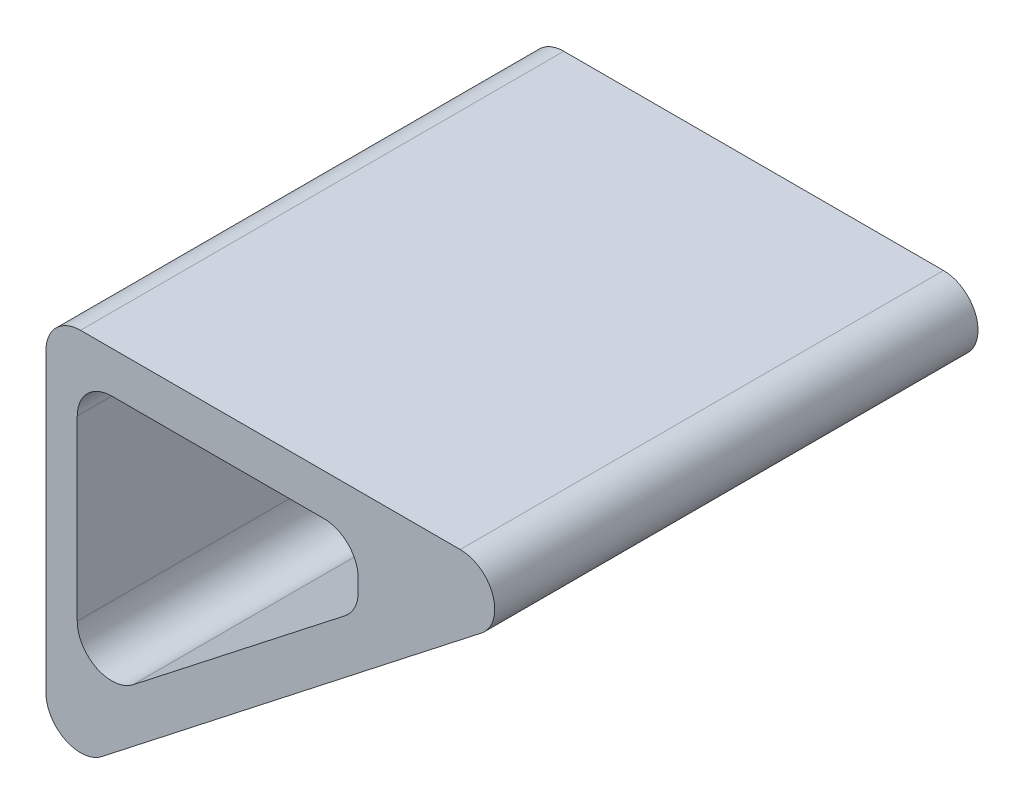
ISO-10303-21;
HEADER;
FILE_DESCRIPTION(('STEP AP214'),'2;1');
FILE_NAME('part.step','',(''),(''),'','','');
FILE_SCHEMA(('AUTOMOTIVE_DESIGN { 1 0 10303 214 1 1 1 1 }'));
ENDSEC;
DATA;
#1=APPLICATION_CONTEXT('core data for automotive mechanical design processes');
#2=APPLICATION_PROTOCOL_DEFINITION('international standard','automotive_design',2000,#1);
#3=PRODUCT_CONTEXT('',#1,'mechanical');
#4=PRODUCT('Part','Part','',(#3));
#5=PRODUCT_RELATED_PRODUCT_CATEGORY('part','',(#4));
#6=PRODUCT_DEFINITION_FORMATION('','',#4);
#7=PRODUCT_DEFINITION_CONTEXT('part definition',#1,'design');
#8=PRODUCT_DEFINITION('design','',#6,#7);
#9=PRODUCT_DEFINITION_SHAPE('','',#8);
#10=(LENGTH_UNIT() NAMED_UNIT(*) SI_UNIT(.MILLI.,.METRE.));
#11=(NAMED_UNIT(*) PLANE_ANGLE_UNIT() SI_UNIT($,.RADIAN.));
#12=(NAMED_UNIT(*) SI_UNIT($,.STERADIAN.) SOLID_ANGLE_UNIT());
#13=UNCERTAINTY_MEASURE_WITH_UNIT(LENGTH_MEASURE(1.E-05),#10,'distance_accuracy_value','');
#14=(GEOMETRIC_REPRESENTATION_CONTEXT(3) GLOBAL_UNCERTAINTY_ASSIGNED_CONTEXT((#13)) GLOBAL_UNIT_ASSIGNED_CONTEXT((#10,
#11,#12)) REPRESENTATION_CONTEXT('',''));
#15=CARTESIAN_POINT('',(0.,0.,0.));
#16=DIRECTION('',(0.,0.,1.));
#17=DIRECTION('',(1.,0.,0.));
#18=AXIS2_PLACEMENT_3D('',#15,#16,#17);
#19=CARTESIAN_POINT('',(21.0206811035827,17.98508750142,70.));
#20=DIRECTION('',(0.,0.,-1.));
#21=DIRECTION('',(-1.,0.,0.));
#22=AXIS2_PLACEMENT_3D('',#19,#20,#21);
#23=CYLINDRICAL_SURFACE('',#22,5.);
#24=CARTESIAN_POINT('',(21.0206811035827,17.98508750142,0.));
#25=DIRECTION('',(0.,0.,1.));
#26=DIRECTION('',(1.,0.,0.));
#27=AXIS2_PLACEMENT_3D('',#24,#25,#26);
#28=CIRCLE('',#27,5.);
#29=CARTESIAN_POINT('',(21.0206811035827,22.98508750142,0.));
#30=VERTEX_POINT('',#29);
#31=CARTESIAN_POINT('',(24.1002909355704,14.0460516698078,0.));
#32=VERTEX_POINT('',#31);
#33=EDGE_CURVE('E236',#30,#32,#28,.F.);
#34=ORIENTED_EDGE('',*,*,#33,.F.);
#35=DIRECTION('',(0.,0.,-1.));
#36=VECTOR('',#35,1.);
#37=CARTESIAN_POINT('',(21.0206811035827,22.98508750142,70.));
#38=LINE('',#37,#36);
#39=CARTESIAN_POINT('',(21.0206811035827,22.98508750142,70.));
#40=VERTEX_POINT('',#39);
#41=EDGE_CURVE('E11',#40,#30,#38,.T.);
#42=ORIENTED_EDGE('',*,*,#41,.F.);
#43=CARTESIAN_POINT('',(21.0206811035827,17.98508750142,70.));
#44=DIRECTION('',(0.,0.,1.));
#45=DIRECTION('',(1.,0.,0.));
#46=AXIS2_PLACEMENT_3D('',#43,#44,#45);
#47=CIRCLE('',#46,5.);
#48=CARTESIAN_POINT('',(24.1002909355704,14.0460516698078,70.));
#49=VERTEX_POINT('',#48);
#50=EDGE_CURVE('E278',#40,#49,#47,.F.);
#51=ORIENTED_EDGE('',*,*,#50,.T.);
#52=DIRECTION('',(0.,0.,-1.));
#53=VECTOR('',#52,1.);
#54=CARTESIAN_POINT('',(24.1002909355704,14.0460516698078,70.));
#55=LINE('',#54,#53);
#56=EDGE_CURVE('E118',#49,#32,#55,.T.);
#57=ORIENTED_EDGE('',*,*,#56,.T.);
#58=EDGE_LOOP('',(#34,#42,#51,#57));
#59=FACE_BOUND('',#58,.T.);
#60=ADVANCED_FACE('F50',(#59),#23,.T.);
#61=CARTESIAN_POINT('',(0.,22.98508750142,70.));
#62=DIRECTION('',(0.,-1.,0.));
#63=DIRECTION('',(0.,0.,-1.));
#64=AXIS2_PLACEMENT_3D('',#61,#62,#63);
#65=PLANE('',#64);
#66=DIRECTION('',(-1.,0.,0.));
#67=VECTOR('',#66,1.);
#68=CARTESIAN_POINT('',(0.,22.98508750142,0.));
#69=LINE('',#68,#67);
#70=CARTESIAN_POINT('',(-33.9793188964173,22.98508750142,0.));
#71=VERTEX_POINT('',#70);
#72=EDGE_CURVE('E232',#30,#71,#69,.T.);
#73=ORIENTED_EDGE('',*,*,#72,.T.);
#74=DIRECTION('',(0.,0.,-1.));
#75=VECTOR('',#74,1.);
#76=CARTESIAN_POINT('',(-33.9793188964173,22.98508750142,70.));
#77=LINE('',#76,#75);
#78=CARTESIAN_POINT('',(-33.9793188964173,22.98508750142,70.));
#79=VERTEX_POINT('',#78);
#80=EDGE_CURVE('E59',#79,#71,#77,.T.);
#81=ORIENTED_EDGE('',*,*,#80,.F.);
#82=DIRECTION('',(-1.,0.,0.));
#83=VECTOR('',#82,1.);
#84=CARTESIAN_POINT('',(0.,22.98508750142,70.));
#85=LINE('',#84,#83);
#86=EDGE_CURVE('E280',#40,#79,#85,.T.);
#87=ORIENTED_EDGE('',*,*,#86,.F.);
#88=ORIENTED_EDGE('',*,*,#41,.T.);
#89=EDGE_LOOP('',(#73,#81,#87,#88));
#90=FACE_BOUND('',#89,.T.);
#91=ADVANCED_FACE('F350',(#90),#65,.F.);
#92=CARTESIAN_POINT('',(-33.9793188964173,17.98508750142,70.));
#93=DIRECTION('',(0.,0.,-1.));
#94=DIRECTION('',(-1.,0.,0.));
#95=AXIS2_PLACEMENT_3D('',#92,#93,#94);
#96=CYLINDRICAL_SURFACE('',#95,5.);
#97=CARTESIAN_POINT('',(-33.9793188964173,17.98508750142,0.));
#98=DIRECTION('',(0.,0.,1.));
#99=DIRECTION('',(1.,0.,0.));
#100=AXIS2_PLACEMENT_3D('',#97,#98,#99);
#101=CIRCLE('',#100,5.);
#102=CARTESIAN_POINT('',(-38.9793188964173,17.98508750142,0.));
#103=VERTEX_POINT('',#102);
#104=EDGE_CURVE('E230',#71,#103,#101,.T.);
#105=ORIENTED_EDGE('',*,*,#104,.T.);
#106=DIRECTION('',(0.,0.,-1.));
#107=VECTOR('',#106,1.);
#108=CARTESIAN_POINT('',(-38.9793188964173,17.98508750142,70.));
#109=LINE('',#108,#107);
#110=CARTESIAN_POINT('',(-38.9793188964173,17.98508750142,70.));
#111=VERTEX_POINT('',#110);
#112=EDGE_CURVE('E181',#111,#103,#109,.T.);
#113=ORIENTED_EDGE('',*,*,#112,.F.);
#114=CARTESIAN_POINT('',(-33.9793188964173,17.98508750142,70.));
#115=DIRECTION('',(0.,0.,1.));
#116=DIRECTION('',(1.,0.,0.));
#117=AXIS2_PLACEMENT_3D('',#114,#115,#116);
#118=CIRCLE('',#117,5.);
#119=EDGE_CURVE('E173',#79,#111,#118,.T.);
#120=ORIENTED_EDGE('',*,*,#119,.F.);
#121=ORIENTED_EDGE('',*,*,#80,.T.);
#122=EDGE_LOOP('',(#105,#113,#120,#121));
#123=FACE_BOUND('',#122,.T.);
#124=ADVANCED_FACE('F352',(#123),#96,.T.);
#125=CARTESIAN_POINT('',(-38.9793188964173,0.,70.));
#126=DIRECTION('',(1.,0.,0.));
#127=DIRECTION('',(0.,1.,0.));
#128=AXIS2_PLACEMENT_3D('',#125,#126,#127);
#129=PLANE('',#128);
#130=DIRECTION('',(0.,-1.,0.));
#131=VECTOR('',#130,1.);
#132=CARTESIAN_POINT('',(-38.9793188964173,0.,0.));
#133=LINE('',#132,#131);
#134=CARTESIAN_POINT('',(-38.9793188964173,-25.01491249858,0.));
#135=VERTEX_POINT('',#134);
#136=EDGE_CURVE('E182',#103,#135,#133,.T.);
#137=ORIENTED_EDGE('',*,*,#136,.T.);
#138=DIRECTION('',(0.,0.,-1.));
#139=VECTOR('',#138,1.);
#140=CARTESIAN_POINT('',(-38.9793188964173,-25.01491249858,70.));
#141=LINE('',#140,#139);
#142=CARTESIAN_POINT('',(-38.9793188964173,-25.01491249858,70.));
#143=VERTEX_POINT('',#142);
#144=EDGE_CURVE('E164',#143,#135,#141,.T.);
#145=ORIENTED_EDGE('',*,*,#144,.F.);
#146=DIRECTION('',(0.,-1.,0.));
#147=VECTOR('',#146,1.);
#148=CARTESIAN_POINT('',(-38.9793188964173,0.,70.));
#149=LINE('',#148,#147);
#150=EDGE_CURVE('E166',#111,#143,#149,.T.);
#151=ORIENTED_EDGE('',*,*,#150,.F.);
#152=ORIENTED_EDGE('',*,*,#112,.T.);
#153=EDGE_LOOP('',(#137,#145,#151,#152));
#154=FACE_BOUND('',#153,.T.);
#155=ADVANCED_FACE('F179',(#154),#129,.F.);
#156=CARTESIAN_POINT('',(-33.9793188964173,-25.01491249858,70.));
#157=DIRECTION('',(0.,0.,-1.));
#158=DIRECTION('',(-1.,0.,0.));
#159=AXIS2_PLACEMENT_3D('',#156,#157,#158);
#160=CYLINDRICAL_SURFACE('',#159,5.);
#161=CARTESIAN_POINT('',(-33.9793188964173,-25.01491249858,0.));
#162=DIRECTION('',(0.,0.,1.));
#163=DIRECTION('',(1.,0.,0.));
#164=AXIS2_PLACEMENT_3D('',#161,#162,#163);
#165=CIRCLE('',#164,5.);
#166=CARTESIAN_POINT('',(-30.8997090644296,-28.9539483301922,0.));
#167=VERTEX_POINT('',#166);
#168=EDGE_CURVE('E223',#135,#167,#165,.T.);
#169=ORIENTED_EDGE('',*,*,#168,.T.);
#170=DIRECTION('',(0.,0.,-1.));
#171=VECTOR('',#170,1.);
#172=CARTESIAN_POINT('',(-30.8997090644296,-28.9539483301922,70.));
#173=LINE('',#172,#171);
#174=CARTESIAN_POINT('',(-30.8997090644296,-28.9539483301922,70.));
#175=VERTEX_POINT('',#174);
#176=EDGE_CURVE('E170',#175,#167,#173,.T.);
#177=ORIENTED_EDGE('',*,*,#176,.F.);
#178=CARTESIAN_POINT('',(-33.9793188964173,-25.01491249858,70.));
#179=DIRECTION('',(0.,0.,1.));
#180=DIRECTION('',(1.,0.,0.));
#181=AXIS2_PLACEMENT_3D('',#178,#179,#180);
#182=CIRCLE('',#181,5.);
#183=EDGE_CURVE('E159',#143,#175,#182,.T.);
#184=ORIENTED_EDGE('',*,*,#183,.F.);
#185=ORIENTED_EDGE('',*,*,#144,.T.);
#186=EDGE_LOOP('',(#169,#177,#184,#185));
#187=FACE_BOUND('',#186,.T.);
#188=ADVANCED_FACE('F162',(#187),#160,.T.);
#189=CARTESIAN_POINT('',(1.24586127284532,11.9981078974386,70.));
#190=DIRECTION('',(0.,0.,-1.));
#191=DIRECTION('',(-1.,0.,0.));
#192=AXIS2_PLACEMENT_3D('',#189,#190,#191);
#193=CYLINDRICAL_SURFACE('',#192,5.);
#194=CARTESIAN_POINT('',(1.24586127284532,11.9981078974386,0.));
#195=DIRECTION('',(0.,0.,1.));
#196=DIRECTION('',(1.,0.,0.));
#197=AXIS2_PLACEMENT_3D('',#194,#195,#196);
#198=CIRCLE('',#197,5.);
#199=CARTESIAN_POINT('',(6.24586127284532,11.9981078974386,0.));
#200=VERTEX_POINT('',#199);
#201=CARTESIAN_POINT('',(1.24586127284532,16.9981078974386,0.));
#202=VERTEX_POINT('',#201);
#203=EDGE_CURVE('E267',#200,#202,#198,.T.);
#204=ORIENTED_EDGE('',*,*,#203,.F.);
#205=DIRECTION('',(0.,0.,-1.));
#206=VECTOR('',#205,1.);
#207=CARTESIAN_POINT('',(6.24586127284532,11.9981078974386,70.));
#208=LINE('',#207,#206);
#209=CARTESIAN_POINT('',(6.24586127284532,11.9981078974386,70.));
#210=VERTEX_POINT('',#209);
#211=EDGE_CURVE('E51',#210,#200,#208,.T.);
#212=ORIENTED_EDGE('',*,*,#211,.F.);
#213=CARTESIAN_POINT('',(1.24586127284532,11.9981078974386,70.));
#214=DIRECTION('',(0.,0.,1.));
#215=DIRECTION('',(1.,0.,0.));
#216=AXIS2_PLACEMENT_3D('',#213,#214,#215);
#217=CIRCLE('',#216,5.);
#218=CARTESIAN_POINT('',(1.24586127284532,16.9981078974386,70.));
#219=VERTEX_POINT('',#218);
#220=EDGE_CURVE('E221',#210,#219,#217,.T.);
#221=ORIENTED_EDGE('',*,*,#220,.T.);
#222=DIRECTION('',(0.,0.,-1.));
#223=VECTOR('',#222,1.);
#224=CARTESIAN_POINT('',(1.24586127284532,16.9981078974386,70.));
#225=LINE('',#224,#223);
#226=EDGE_CURVE('E192',#219,#202,#225,.T.);
#227=ORIENTED_EDGE('',*,*,#226,.T.);
#228=EDGE_LOOP('',(#204,#212,#221,#227));
#229=FACE_BOUND('',#228,.T.);
#230=ADVANCED_FACE('F47',(#229),#193,.F.);
#231=CARTESIAN_POINT('',(6.24586127284532,0.,70.));
#232=DIRECTION('',(-1.,0.,0.));
#233=DIRECTION('',(0.,0.,1.));
#234=AXIS2_PLACEMENT_3D('',#231,#232,#233);
#235=PLANE('',#234);
#236=DIRECTION('',(0.,1.,0.));
#237=VECTOR('',#236,1.);
#238=CARTESIAN_POINT('',(6.24586127284532,0.,0.));
#239=LINE('',#238,#237);
#240=CARTESIAN_POINT('',(6.24586127284532,10.2631668832141,0.));
#241=VERTEX_POINT('',#240);
#242=EDGE_CURVE('E264',#241,#200,#239,.T.);
#243=ORIENTED_EDGE('',*,*,#242,.F.);
#244=DIRECTION('',(0.,0.,-1.));
#245=VECTOR('',#244,1.);
#246=CARTESIAN_POINT('',(6.24586127284532,10.2631668832141,70.));
#247=LINE('',#246,#245);
#248=CARTESIAN_POINT('',(6.24586127284532,10.2631668832141,70.));
#249=VERTEX_POINT('',#248);
#250=EDGE_CURVE('E211',#249,#241,#247,.T.);
#251=ORIENTED_EDGE('',*,*,#250,.F.);
#252=DIRECTION('',(0.,1.,0.));
#253=VECTOR('',#252,1.);
#254=CARTESIAN_POINT('',(6.24586127284532,0.,70.));
#255=LINE('',#254,#253);
#256=EDGE_CURVE('E304',#249,#210,#255,.T.);
#257=ORIENTED_EDGE('',*,*,#256,.T.);
#258=ORIENTED_EDGE('',*,*,#211,.T.);
#259=EDGE_LOOP('',(#243,#251,#257,#258));
#260=FACE_BOUND('',#259,.T.);
#261=ADVANCED_FACE('F325',(#260),#235,.T.);
#262=CARTESIAN_POINT('',(1.24586127284532,10.2631668832141,70.));
#263=DIRECTION('',(0.,0.,-1.));
#264=DIRECTION('',(-1.,0.,0.));
#265=AXIS2_PLACEMENT_3D('',#262,#263,#264);
#266=CYLINDRICAL_SURFACE('',#265,5.);
#267=CARTESIAN_POINT('',(1.24586127284532,10.2631668832141,0.));
#268=DIRECTION('',(0.,0.,1.));
#269=DIRECTION('',(1.,0.,0.));
#270=AXIS2_PLACEMENT_3D('',#267,#268,#269);
#271=CIRCLE('',#270,5.);
#272=CARTESIAN_POINT('',(4.32547110483303,6.32413105160194,0.));
#273=VERTEX_POINT('',#272);
#274=EDGE_CURVE('E261',#273,#241,#271,.T.);
#275=ORIENTED_EDGE('',*,*,#274,.F.);
#276=DIRECTION('',(0.,0.,-1.));
#277=VECTOR('',#276,1.);
#278=CARTESIAN_POINT('',(4.32547110483303,6.32413105160194,70.));
#279=LINE('',#278,#277);
#280=CARTESIAN_POINT('',(4.32547110483303,6.32413105160194,70.));
#281=VERTEX_POINT('',#280);
#282=EDGE_CURVE('E207',#281,#273,#279,.T.);
#283=ORIENTED_EDGE('',*,*,#282,.F.);
#284=CARTESIAN_POINT('',(1.24586127284532,10.2631668832141,70.));
#285=DIRECTION('',(0.,0.,1.));
#286=DIRECTION('',(1.,0.,0.));
#287=AXIS2_PLACEMENT_3D('',#284,#285,#286);
#288=CIRCLE('',#287,5.);
#289=EDGE_CURVE('E305',#281,#249,#288,.T.);
#290=ORIENTED_EDGE('',*,*,#289,.T.);
#291=ORIENTED_EDGE('',*,*,#250,.T.);
#292=EDGE_LOOP('',(#275,#283,#290,#291));
#293=FACE_BOUND('',#292,.T.);
#294=ADVANCED_FACE('F324',(#293),#266,.F.);
#295=CARTESIAN_POINT('',(-1.42773366110019,1.82617096187233,70.));
#296=DIRECTION('',(-0.615921966397541,0.787807166322436,0.));
#297=DIRECTION('',(-0.787807166322436,-0.615921966397541,0.));
#298=AXIS2_PLACEMENT_3D('',#295,#296,#297);
#299=PLANE('',#298);
#300=DIRECTION('',(0.787807166322436,0.615921966397541,0.));
#301=VECTOR('',#300,1.);
#302=CARTESIAN_POINT('',(-1.42773366110019,1.82617096187233,0.));
#303=LINE('',#302,#301);
#304=CARTESIAN_POINT('',(-26.3734918448109,-17.6768763453924,0.));
#305=VERTEX_POINT('',#304);
#306=EDGE_CURVE('E260',#305,#273,#303,.T.);
#307=ORIENTED_EDGE('',*,*,#306,.F.);
#308=DIRECTION('',(0.,0.,-1.));
#309=VECTOR('',#308,1.);
#310=CARTESIAN_POINT('',(-26.3734918448109,-17.6768763453924,70.));
#311=LINE('',#310,#309);
#312=CARTESIAN_POINT('',(-26.3734918448109,-17.6768763453924,70.));
#313=VERTEX_POINT('',#312);
#314=EDGE_CURVE('E206',#313,#305,#311,.T.);
#315=ORIENTED_EDGE('',*,*,#314,.F.);
#316=DIRECTION('',(0.787807166322436,0.615921966397541,0.));
#317=VECTOR('',#316,1.);
#318=CARTESIAN_POINT('',(-1.42773366110019,1.82617096187233,70.));
#319=LINE('',#318,#317);
#320=EDGE_CURVE('E299',#313,#281,#319,.T.);
#321=ORIENTED_EDGE('',*,*,#320,.T.);
#322=ORIENTED_EDGE('',*,*,#282,.T.);
#323=EDGE_LOOP('',(#307,#315,#321,#322));
#324=FACE_BOUND('',#323,.T.);
#325=ADVANCED_FACE('F327',(#324),#299,.T.);
#326=CARTESIAN_POINT('',(-29.4531016767986,-13.7378405137803,70.));
#327=DIRECTION('',(0.,0.,-1.));
#328=DIRECTION('',(-1.,0.,0.));
#329=AXIS2_PLACEMENT_3D('',#326,#327,#328);
#330=CYLINDRICAL_SURFACE('',#329,4.99999999999999);
#331=CARTESIAN_POINT('',(-29.4531016767986,-13.7378405137803,0.));
#332=DIRECTION('',(0.,0.,1.));
#333=DIRECTION('',(1.,0.,0.));
#334=AXIS2_PLACEMENT_3D('',#331,#332,#333);
#335=CIRCLE('',#334,4.99999999999999);
#336=CARTESIAN_POINT('',(-34.4531016767986,-13.7378405137803,0.));
#337=VERTEX_POINT('',#336);
#338=EDGE_CURVE('E251',#337,#305,#335,.T.);
#339=ORIENTED_EDGE('',*,*,#338,.F.);
#340=DIRECTION('',(0.,0.,-1.));
#341=VECTOR('',#340,1.);
#342=CARTESIAN_POINT('',(-34.4531016767986,-13.7378405137803,70.));
#343=LINE('',#342,#341);
#344=CARTESIAN_POINT('',(-34.4531016767986,-13.7378405137803,70.));
#345=VERTEX_POINT('',#344);
#346=EDGE_CURVE('E201',#345,#337,#343,.T.);
#347=ORIENTED_EDGE('',*,*,#346,.F.);
#348=CARTESIAN_POINT('',(-29.4531016767986,-13.7378405137803,70.));
#349=DIRECTION('',(0.,0.,1.));
#350=DIRECTION('',(1.,0.,0.));
#351=AXIS2_PLACEMENT_3D('',#348,#349,#350);
#352=CIRCLE('',#351,4.99999999999999);
#353=EDGE_CURVE('E294',#345,#313,#352,.T.);
#354=ORIENTED_EDGE('',*,*,#353,.T.);
#355=ORIENTED_EDGE('',*,*,#314,.T.);
#356=EDGE_LOOP('',(#339,#347,#354,#355));
#357=FACE_BOUND('',#356,.T.);
#358=ADVANCED_FACE('F335',(#357),#330,.F.);
#359=CARTESIAN_POINT('',(-34.4531016767986,0.,70.));
#360=DIRECTION('',(1.,0.,0.));
#361=DIRECTION('',(0.,0.,-1.));
#362=AXIS2_PLACEMENT_3D('',#359,#360,#361);
#363=PLANE('',#362);
#364=DIRECTION('',(0.,-1.,0.));
#365=VECTOR('',#364,1.);
#366=CARTESIAN_POINT('',(-34.4531016767986,0.,0.));
#367=LINE('',#366,#365);
#368=CARTESIAN_POINT('',(-34.4531016767986,11.9981078974386,0.));
#369=VERTEX_POINT('',#368);
#370=EDGE_CURVE('E247',#369,#337,#367,.T.);
#371=ORIENTED_EDGE('',*,*,#370,.F.);
#372=DIRECTION('',(0.,0.,-1.));
#373=VECTOR('',#372,1.);
#374=CARTESIAN_POINT('',(-34.4531016767986,11.9981078974386,70.));
#375=LINE('',#374,#373);
#376=CARTESIAN_POINT('',(-34.4531016767986,11.9981078974386,70.));
#377=VERTEX_POINT('',#376);
#378=EDGE_CURVE('E199',#377,#369,#375,.T.);
#379=ORIENTED_EDGE('',*,*,#378,.F.);
#380=DIRECTION('',(0.,-1.,0.));
#381=VECTOR('',#380,1.);
#382=CARTESIAN_POINT('',(-34.4531016767986,0.,70.));
#383=LINE('',#382,#381);
#384=EDGE_CURVE('E289',#377,#345,#383,.T.);
#385=ORIENTED_EDGE('',*,*,#384,.T.);
#386=ORIENTED_EDGE('',*,*,#346,.T.);
#387=EDGE_LOOP('',(#371,#379,#385,#386));
#388=FACE_BOUND('',#387,.T.);
#389=ADVANCED_FACE('F331',(#388),#363,.T.);
#390=CARTESIAN_POINT('',(-29.4531016767986,11.9981078974386,70.));
#391=DIRECTION('',(0.,0.,-1.));
#392=DIRECTION('',(-1.,0.,0.));
#393=AXIS2_PLACEMENT_3D('',#390,#391,#392);
#394=CYLINDRICAL_SURFACE('',#393,4.99999999999999);
#395=CARTESIAN_POINT('',(-29.4531016767986,11.9981078974386,0.));
#396=DIRECTION('',(0.,0.,1.));
#397=DIRECTION('',(1.,0.,0.));
#398=AXIS2_PLACEMENT_3D('',#395,#396,#397);
#399=CIRCLE('',#398,4.99999999999999);
#400=CARTESIAN_POINT('',(-29.4531016767986,16.9981078974386,0.));
#401=VERTEX_POINT('',#400);
#402=EDGE_CURVE('E245',#369,#401,#399,.F.);
#403=ORIENTED_EDGE('',*,*,#402,.T.);
#404=DIRECTION('',(0.,0.,-1.));
#405=VECTOR('',#404,1.);
#406=CARTESIAN_POINT('',(-29.4531016767986,16.9981078974386,70.));
#407=LINE('',#406,#405);
#408=CARTESIAN_POINT('',(-29.4531016767986,16.9981078974386,70.));
#409=VERTEX_POINT('',#408);
#410=EDGE_CURVE('E197',#409,#401,#407,.T.);
#411=ORIENTED_EDGE('',*,*,#410,.F.);
#412=CARTESIAN_POINT('',(-29.4531016767986,11.9981078974386,70.));
#413=DIRECTION('',(0.,0.,1.));
#414=DIRECTION('',(1.,0.,0.));
#415=AXIS2_PLACEMENT_3D('',#412,#413,#414);
#416=CIRCLE('',#415,4.99999999999999);
#417=EDGE_CURVE('E290',#377,#409,#416,.F.);
#418=ORIENTED_EDGE('',*,*,#417,.F.);
#419=ORIENTED_EDGE('',*,*,#378,.T.);
#420=EDGE_LOOP('',(#403,#411,#418,#419));
#421=FACE_BOUND('',#420,.T.);
#422=ADVANCED_FACE('F336',(#421),#394,.F.);
#423=CARTESIAN_POINT('',(0.,16.9981078974386,70.));
#424=DIRECTION('',(0.,-1.,0.));
#425=DIRECTION('',(1.,0.,0.));
#426=AXIS2_PLACEMENT_3D('',#423,#424,#425);
#427=PLANE('',#426);
#428=DIRECTION('',(-1.,0.,0.));
#429=VECTOR('',#428,1.);
#430=CARTESIAN_POINT('',(0.,16.9981078974386,0.));
#431=LINE('',#430,#429);
#432=EDGE_CURVE('E241',#202,#401,#431,.T.);
#433=ORIENTED_EDGE('',*,*,#432,.F.);
#434=ORIENTED_EDGE('',*,*,#226,.F.);
#435=DIRECTION('',(-1.,0.,0.));
#436=VECTOR('',#435,1.);
#437=CARTESIAN_POINT('',(0.,16.9981078974386,70.));
#438=LINE('',#437,#436);
#439=EDGE_CURVE('E284',#219,#409,#438,.T.);
#440=ORIENTED_EDGE('',*,*,#439,.T.);
#441=ORIENTED_EDGE('',*,*,#410,.T.);
#442=EDGE_LOOP('',(#433,#434,#440,#441));
#443=FACE_BOUND('',#442,.T.);
#444=ADVANCED_FACE('F320',(#443),#427,.T.);
#445=CARTESIAN_POINT('',(2.32714931078664,-2.97658632775035,70.));
#446=DIRECTION('',(-0.615921966397541,0.787807166322436,0.));
#447=DIRECTION('',(-0.787807166322436,-0.615921966397541,0.));
#448=AXIS2_PLACEMENT_3D('',#445,#446,#447);
#449=PLANE('',#448);
#450=DIRECTION('',(0.787807166322436,0.615921966397541,0.));
#451=VECTOR('',#450,1.);
#452=CARTESIAN_POINT('',(2.32714931078664,-2.97658632775035,0.));
#453=LINE('',#452,#451);
#454=EDGE_CURVE('E115',#167,#32,#453,.T.);
#455=ORIENTED_EDGE('',*,*,#454,.T.);
#456=ORIENTED_EDGE('',*,*,#56,.F.);
#457=DIRECTION('',(0.787807166322436,0.615921966397541,0.));
#458=VECTOR('',#457,1.);
#459=CARTESIAN_POINT('',(2.32714931078664,-2.97658632775035,70.));
#460=LINE('',#459,#458);
#461=EDGE_CURVE('E70',#175,#49,#460,.T.);
#462=ORIENTED_EDGE('',*,*,#461,.F.);
#463=ORIENTED_EDGE('',*,*,#176,.T.);
#464=EDGE_LOOP('',(#455,#456,#462,#463));
#465=FACE_BOUND('',#464,.T.);
#466=ADVANCED_FACE('F341',(#465),#449,.F.);
#467=CARTESIAN_POINT('',(0.,0.,70.));
#468=DIRECTION('',(0.,0.,1.));
#469=DIRECTION('',(1.,0.,0.));
#470=AXIS2_PLACEMENT_3D('',#467,#468,#469);
#471=PLANE('',#470);
#472=ORIENTED_EDGE('',*,*,#220,.F.);
#473=ORIENTED_EDGE('',*,*,#256,.F.);
#474=ORIENTED_EDGE('',*,*,#289,.F.);
#475=ORIENTED_EDGE('',*,*,#320,.F.);
#476=ORIENTED_EDGE('',*,*,#353,.F.);
#477=ORIENTED_EDGE('',*,*,#384,.F.);
#478=ORIENTED_EDGE('',*,*,#417,.T.);
#479=ORIENTED_EDGE('',*,*,#439,.F.);
#480=EDGE_LOOP('',(#472,#473,#474,#475,#476,#477,#478,#479));
#481=FACE_BOUND('',#480,.T.);
#482=ORIENTED_EDGE('',*,*,#50,.F.);
#483=ORIENTED_EDGE('',*,*,#86,.T.);
#484=ORIENTED_EDGE('',*,*,#119,.T.);
#485=ORIENTED_EDGE('',*,*,#150,.T.);
#486=ORIENTED_EDGE('',*,*,#183,.T.);
#487=ORIENTED_EDGE('',*,*,#461,.T.);
#488=EDGE_LOOP('',(#482,#483,#484,#485,#486,#487));
#489=FACE_BOUND('',#488,.T.);
#490=ADVANCED_FACE('F172',(#481,#489),#471,.T.);
#491=CARTESIAN_POINT('',(0.,0.,0.));
#492=DIRECTION('',(0.,0.,1.));
#493=DIRECTION('',(1.,0.,0.));
#494=AXIS2_PLACEMENT_3D('',#491,#492,#493);
#495=PLANE('',#494);
#496=ORIENTED_EDGE('',*,*,#203,.T.);
#497=ORIENTED_EDGE('',*,*,#432,.T.);
#498=ORIENTED_EDGE('',*,*,#402,.F.);
#499=ORIENTED_EDGE('',*,*,#370,.T.);
#500=ORIENTED_EDGE('',*,*,#338,.T.);
#501=ORIENTED_EDGE('',*,*,#306,.T.);
#502=ORIENTED_EDGE('',*,*,#274,.T.);
#503=ORIENTED_EDGE('',*,*,#242,.T.);
#504=EDGE_LOOP('',(#496,#497,#498,#499,#500,#501,#502,#503));
#505=FACE_BOUND('',#504,.T.);
#506=ORIENTED_EDGE('',*,*,#33,.T.);
#507=ORIENTED_EDGE('',*,*,#454,.F.);
#508=ORIENTED_EDGE('',*,*,#168,.F.);
#509=ORIENTED_EDGE('',*,*,#136,.F.);
#510=ORIENTED_EDGE('',*,*,#104,.F.);
#511=ORIENTED_EDGE('',*,*,#72,.F.);
#512=EDGE_LOOP('',(#506,#507,#508,#509,#510,#511));
#513=FACE_BOUND('',#512,.T.);
#514=ADVANCED_FACE('F319',(#505,#513),#495,.F.);
#515=CLOSED_SHELL('',(#60,#91,#124,#155,#188,#230,#261,#294,#325,#358,#389,#422,#444,#466,#490,#514));
#516=MANIFOLD_SOLID_BREP('B2',#515);
#517=ADVANCED_BREP_SHAPE_REPRESENTATION('',(#18,#516),#14);
#518=SHAPE_DEFINITION_REPRESENTATION(#9,#517);
ENDSEC;
END-ISO-10303-21;
